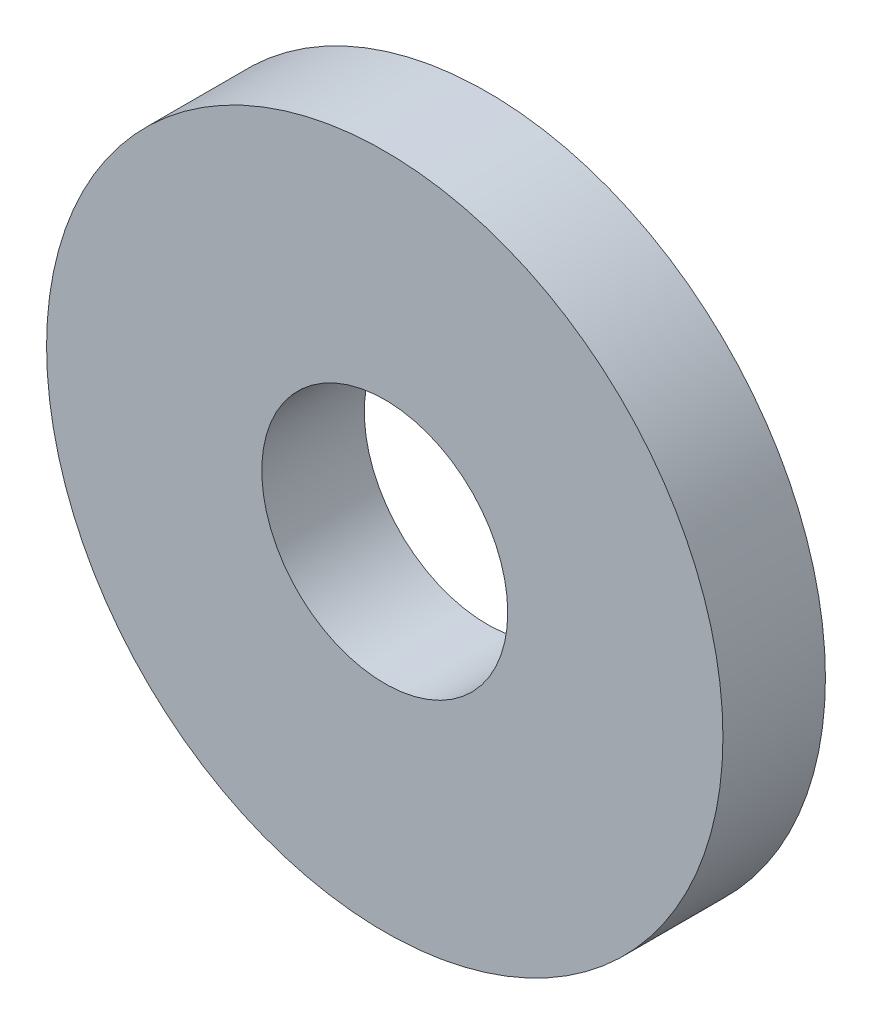
ISO-10303-21;
HEADER;
FILE_DESCRIPTION(('STEP AP214'),'2;1');
FILE_NAME('part.step','',(''),(''),'','','');
FILE_SCHEMA(('AUTOMOTIVE_DESIGN { 1 0 10303 214 1 1 1 1 }'));
ENDSEC;
DATA;
#1=APPLICATION_CONTEXT('core data for automotive mechanical design processes');
#2=APPLICATION_PROTOCOL_DEFINITION('international standard','automotive_design',2000,#1);
#3=PRODUCT_CONTEXT('',#1,'mechanical');
#4=PRODUCT('Part','Part','',(#3));
#5=PRODUCT_RELATED_PRODUCT_CATEGORY('part','',(#4));
#6=PRODUCT_DEFINITION_FORMATION('','',#4);
#7=PRODUCT_DEFINITION_CONTEXT('part definition',#1,'design');
#8=PRODUCT_DEFINITION('design','',#6,#7);
#9=PRODUCT_DEFINITION_SHAPE('','',#8);
#10=(LENGTH_UNIT() NAMED_UNIT(*) SI_UNIT(.MILLI.,.METRE.));
#11=(NAMED_UNIT(*) PLANE_ANGLE_UNIT() SI_UNIT($,.RADIAN.));
#12=(NAMED_UNIT(*) SI_UNIT($,.STERADIAN.) SOLID_ANGLE_UNIT());
#13=UNCERTAINTY_MEASURE_WITH_UNIT(LENGTH_MEASURE(1.E-05),#10,'distance_accuracy_value','');
#14=(GEOMETRIC_REPRESENTATION_CONTEXT(3) GLOBAL_UNCERTAINTY_ASSIGNED_CONTEXT((#13)) GLOBAL_UNIT_ASSIGNED_CONTEXT((#10,
#11,#12)) REPRESENTATION_CONTEXT('',''));
#15=CARTESIAN_POINT('',(0.,0.,0.));
#16=DIRECTION('',(0.,0.,1.));
#17=DIRECTION('',(1.,0.,0.));
#18=AXIS2_PLACEMENT_3D('',#15,#16,#17);
#19=CARTESIAN_POINT('',(-94.3012720118339,77.230107029859,5.));
#20=DIRECTION('',(0.,0.,1.));
#21=DIRECTION('',(1.,0.,0.));
#22=AXIS2_PLACEMENT_3D('',#19,#20,#21);
#23=PLANE('',#22);
#24=CARTESIAN_POINT('',(-94.3012720118339,77.230107029859,5.));
#25=DIRECTION('',(0.,0.,1.));
#26=DIRECTION('',(1.,0.,0.));
#27=AXIS2_PLACEMENT_3D('',#24,#25,#26);
#28=CIRCLE('',#27,16.5);
#29=CARTESIAN_POINT('',(-77.8012720118339,77.230107029859,5.));
#30=VERTEX_POINT('',#29);
#31=EDGE_CURVE('E10',#30,#30,#28,.T.);
#32=ORIENTED_EDGE('',*,*,#31,.T.);
#33=EDGE_LOOP('',(#32));
#34=FACE_BOUND('',#33,.T.);
#35=CARTESIAN_POINT('',(-94.3012720118339,77.230107029859,5.));
#36=DIRECTION('',(0.,0.,1.));
#37=DIRECTION('',(1.,0.,0.));
#38=AXIS2_PLACEMENT_3D('',#35,#36,#37);
#39=CIRCLE('',#38,6.);
#40=CARTESIAN_POINT('',(-88.3012720118339,77.230107029859,5.));
#41=VERTEX_POINT('',#40);
#42=EDGE_CURVE('E44',#41,#41,#39,.T.);
#43=ORIENTED_EDGE('',*,*,#42,.F.);
#44=EDGE_LOOP('',(#43));
#45=FACE_BOUND('',#44,.T.);
#46=ADVANCED_FACE('F33',(#34,#45),#23,.T.);
#47=CARTESIAN_POINT('',(-94.3012720118339,77.230107029859,0.));
#48=DIRECTION('',(0.,0.,1.));
#49=DIRECTION('',(1.,0.,0.));
#50=AXIS2_PLACEMENT_3D('',#47,#48,#49);
#51=PLANE('',#50);
#52=CARTESIAN_POINT('',(-94.3012720118339,77.230107029859,0.));
#53=DIRECTION('',(0.,0.,1.));
#54=DIRECTION('',(1.,0.,0.));
#55=AXIS2_PLACEMENT_3D('',#52,#53,#54);
#56=CIRCLE('',#55,16.5);
#57=CARTESIAN_POINT('',(-77.8012720118339,77.230107029859,0.));
#58=VERTEX_POINT('',#57);
#59=EDGE_CURVE('E37',#58,#58,#56,.T.);
#60=ORIENTED_EDGE('',*,*,#59,.F.);
#61=EDGE_LOOP('',(#60));
#62=FACE_BOUND('',#61,.T.);
#63=CARTESIAN_POINT('',(-94.3012720118339,77.230107029859,0.));
#64=DIRECTION('',(0.,0.,1.));
#65=DIRECTION('',(1.,0.,0.));
#66=AXIS2_PLACEMENT_3D('',#63,#64,#65);
#67=CIRCLE('',#66,6.);
#68=CARTESIAN_POINT('',(-88.3012720118339,77.230107029859,0.));
#69=VERTEX_POINT('',#68);
#70=EDGE_CURVE('E46',#69,#69,#67,.T.);
#71=ORIENTED_EDGE('',*,*,#70,.T.);
#72=EDGE_LOOP('',(#71));
#73=FACE_BOUND('',#72,.T.);
#74=ADVANCED_FACE('F56',(#62,#73),#51,.F.);
#75=CARTESIAN_POINT('',(-94.3012720118339,77.230107029859,5.));
#76=DIRECTION('',(0.,0.,-1.));
#77=DIRECTION('',(-1.,0.,0.));
#78=AXIS2_PLACEMENT_3D('',#75,#76,#77);
#79=CYLINDRICAL_SURFACE('',#78,16.5);
#80=ORIENTED_EDGE('',*,*,#31,.F.);
#81=EDGE_LOOP('',(#80));
#82=FACE_BOUND('',#81,.T.);
#83=ORIENTED_EDGE('',*,*,#59,.T.);
#84=EDGE_LOOP('',(#83));
#85=FACE_BOUND('',#84,.T.);
#86=ADVANCED_FACE('F35',(#82,#85),#79,.T.);
#87=CARTESIAN_POINT('',(-94.3012720118339,77.230107029859,5.));
#88=DIRECTION('',(0.,0.,-1.));
#89=DIRECTION('',(-1.,0.,0.));
#90=AXIS2_PLACEMENT_3D('',#87,#88,#89);
#91=CYLINDRICAL_SURFACE('',#90,6.);
#92=ORIENTED_EDGE('',*,*,#42,.T.);
#93=EDGE_LOOP('',(#92));
#94=FACE_BOUND('',#93,.T.);
#95=ORIENTED_EDGE('',*,*,#70,.F.);
#96=EDGE_LOOP('',(#95));
#97=FACE_BOUND('',#96,.T.);
#98=ADVANCED_FACE('F52',(#94,#97),#91,.F.);
#99=CLOSED_SHELL('',(#46,#74,#86,#98));
#100=MANIFOLD_SOLID_BREP('B2',#99);
#101=ADVANCED_BREP_SHAPE_REPRESENTATION('',(#18,#100),#14);
#102=SHAPE_DEFINITION_REPRESENTATION(#9,#101);
ENDSEC;
END-ISO-10303-21;
